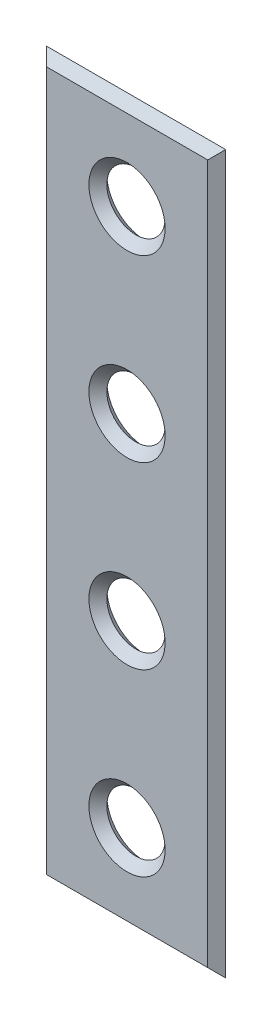
ISO-10303-21;
HEADER;
FILE_DESCRIPTION(('STEP AP214'),'2;1');
FILE_NAME('part.step','',(''),(''),'','','');
FILE_SCHEMA(('AUTOMOTIVE_DESIGN { 1 0 10303 214 1 1 1 1 }'));
ENDSEC;
DATA;
#1=APPLICATION_CONTEXT('core data for automotive mechanical design processes');
#2=APPLICATION_PROTOCOL_DEFINITION('international standard','automotive_design',2000,#1);
#3=PRODUCT_CONTEXT('',#1,'mechanical');
#4=PRODUCT('Part','Part','',(#3));
#5=PRODUCT_RELATED_PRODUCT_CATEGORY('part','',(#4));
#6=PRODUCT_DEFINITION_FORMATION('','',#4);
#7=PRODUCT_DEFINITION_CONTEXT('part definition',#1,'design');
#8=PRODUCT_DEFINITION('design','',#6,#7);
#9=PRODUCT_DEFINITION_SHAPE('','',#8);
#10=(LENGTH_UNIT() NAMED_UNIT(*) SI_UNIT(.MILLI.,.METRE.));
#11=(NAMED_UNIT(*) PLANE_ANGLE_UNIT() SI_UNIT($,.RADIAN.));
#12=(NAMED_UNIT(*) SI_UNIT($,.STERADIAN.) SOLID_ANGLE_UNIT());
#13=UNCERTAINTY_MEASURE_WITH_UNIT(LENGTH_MEASURE(1.E-05),#10,'distance_accuracy_value','');
#14=(GEOMETRIC_REPRESENTATION_CONTEXT(3) GLOBAL_UNCERTAINTY_ASSIGNED_CONTEXT((#13)) GLOBAL_UNIT_ASSIGNED_CONTEXT((#10,
#11,#12)) REPRESENTATION_CONTEXT('',''));
#15=CARTESIAN_POINT('',(0.,0.,0.));
#16=DIRECTION('',(0.,0.,1.));
#17=DIRECTION('',(1.,0.,0.));
#18=AXIS2_PLACEMENT_3D('',#15,#16,#17);
#19=CARTESIAN_POINT('',(0.,0.,8.));
#20=DIRECTION('',(0.,0.,-1.));
#21=DIRECTION('',(-1.,0.,0.));
#22=AXIS2_PLACEMENT_3D('',#19,#20,#21);
#23=PLANE('',#22);
#24=CARTESIAN_POINT('',(40.,40.,8.));
#25=DIRECTION('',(0.,0.,-1.));
#26=DIRECTION('',(-1.,0.,0.));
#27=AXIS2_PLACEMENT_3D('',#24,#25,#26);
#28=CIRCLE('',#27,17.);
#29=CARTESIAN_POINT('',(23.,40.,8.));
#30=VERTEX_POINT('',#29);
#31=EDGE_CURVE('E11',#30,#30,#28,.T.);
#32=ORIENTED_EDGE('',*,*,#31,.T.);
#33=EDGE_LOOP('',(#32));
#34=FACE_BOUND('',#33,.T.);
#35=CARTESIAN_POINT('',(40.,200.,8.));
#36=DIRECTION('',(0.,0.,-1.));
#37=DIRECTION('',(-1.,0.,0.));
#38=AXIS2_PLACEMENT_3D('',#35,#36,#37);
#39=CIRCLE('',#38,17.);
#40=CARTESIAN_POINT('',(22.9999999999999,200.,8.));
#41=VERTEX_POINT('',#40);
#42=EDGE_CURVE('E44',#41,#41,#39,.T.);
#43=ORIENTED_EDGE('',*,*,#42,.T.);
#44=EDGE_LOOP('',(#43));
#45=FACE_BOUND('',#44,.T.);
#46=DIRECTION('',(0.,1.,0.));
#47=VECTOR('',#46,1.);
#48=CARTESIAN_POINT('',(76.,0.,8.));
#49=LINE('',#48,#47);
#50=CARTESIAN_POINT('',(76.,4.00000000000001,8.));
#51=VERTEX_POINT('',#50);
#52=CARTESIAN_POINT('',(76.,316.,8.));
#53=VERTEX_POINT('',#52);
#54=EDGE_CURVE('E53',#51,#53,#49,.T.);
#55=ORIENTED_EDGE('',*,*,#54,.T.);
#56=DIRECTION('',(-1.,0.,0.));
#57=VECTOR('',#56,1.);
#58=CARTESIAN_POINT('',(0.,316.,8.));
#59=LINE('',#58,#57);
#60=CARTESIAN_POINT('',(3.99999999999993,316.,8.));
#61=VERTEX_POINT('',#60);
#62=EDGE_CURVE('E102',#53,#61,#59,.T.);
#63=ORIENTED_EDGE('',*,*,#62,.T.);
#64=DIRECTION('',(0.,-1.,0.));
#65=VECTOR('',#64,1.);
#66=CARTESIAN_POINT('',(4.,0.,8.));
#67=LINE('',#66,#65);
#68=CARTESIAN_POINT('',(4.,4.,8.));
#69=VERTEX_POINT('',#68);
#70=EDGE_CURVE('E97',#61,#69,#67,.T.);
#71=ORIENTED_EDGE('',*,*,#70,.T.);
#72=DIRECTION('',(1.,0.,0.));
#73=VECTOR('',#72,1.);
#74=CARTESIAN_POINT('',(0.,4.,8.));
#75=LINE('',#74,#73);
#76=EDGE_CURVE('E101',#69,#51,#75,.T.);
#77=ORIENTED_EDGE('',*,*,#76,.T.);
#78=EDGE_LOOP('',(#55,#63,#71,#77));
#79=FACE_BOUND('',#78,.T.);
#80=CARTESIAN_POINT('',(40.,280.,8.));
#81=DIRECTION('',(0.,0.,-1.));
#82=DIRECTION('',(-1.,0.,0.));
#83=AXIS2_PLACEMENT_3D('',#80,#81,#82);
#84=CIRCLE('',#83,17.);
#85=CARTESIAN_POINT('',(22.9999999999999,280.,8.));
#86=VERTEX_POINT('',#85);
#87=EDGE_CURVE('E103',#86,#86,#84,.T.);
#88=ORIENTED_EDGE('',*,*,#87,.T.);
#89=EDGE_LOOP('',(#88));
#90=FACE_BOUND('',#89,.T.);
#91=CARTESIAN_POINT('',(40.,120.,8.));
#92=DIRECTION('',(0.,0.,-1.));
#93=DIRECTION('',(-1.,0.,0.));
#94=AXIS2_PLACEMENT_3D('',#91,#92,#93);
#95=CIRCLE('',#94,17.);
#96=CARTESIAN_POINT('',(23.,120.,8.));
#97=VERTEX_POINT('',#96);
#98=EDGE_CURVE('E230',#97,#97,#95,.T.);
#99=ORIENTED_EDGE('',*,*,#98,.T.);
#100=EDGE_LOOP('',(#99));
#101=FACE_BOUND('',#100,.T.);
#102=ADVANCED_FACE('F34',(#34,#45,#79,#90,#101),#23,.F.);
#103=CARTESIAN_POINT('',(0.,0.,0.));
#104=DIRECTION('',(0.,0.,-1.));
#105=DIRECTION('',(-1.,0.,0.));
#106=AXIS2_PLACEMENT_3D('',#103,#104,#105);
#107=PLANE('',#106);
#108=CARTESIAN_POINT('',(40.,40.,0.));
#109=DIRECTION('',(0.,0.,-1.));
#110=DIRECTION('',(-1.,0.,0.));
#111=AXIS2_PLACEMENT_3D('',#108,#109,#110);
#112=CIRCLE('',#111,17.);
#113=CARTESIAN_POINT('',(23.,40.,0.));
#114=VERTEX_POINT('',#113);
#115=EDGE_CURVE('E232',#114,#114,#112,.F.);
#116=ORIENTED_EDGE('',*,*,#115,.T.);
#117=EDGE_LOOP('',(#116));
#118=FACE_BOUND('',#117,.T.);
#119=CARTESIAN_POINT('',(40.,200.,0.));
#120=DIRECTION('',(0.,0.,-1.));
#121=DIRECTION('',(-1.,0.,0.));
#122=AXIS2_PLACEMENT_3D('',#119,#120,#121);
#123=CIRCLE('',#122,17.);
#124=CARTESIAN_POINT('',(23.,200.,0.));
#125=VERTEX_POINT('',#124);
#126=EDGE_CURVE('E237',#125,#125,#123,.F.);
#127=ORIENTED_EDGE('',*,*,#126,.T.);
#128=EDGE_LOOP('',(#127));
#129=FACE_BOUND('',#128,.T.);
#130=DIRECTION('',(0.,-1.,0.));
#131=VECTOR('',#130,1.);
#132=CARTESIAN_POINT('',(76.,0.,0.));
#133=LINE('',#132,#131);
#134=CARTESIAN_POINT('',(76.,316.,0.));
#135=VERTEX_POINT('',#134);
#136=CARTESIAN_POINT('',(76.,4.00000000000002,0.));
#137=VERTEX_POINT('',#136);
#138=EDGE_CURVE('E243',#135,#137,#133,.T.);
#139=ORIENTED_EDGE('',*,*,#138,.T.);
#140=DIRECTION('',(-1.,0.,0.));
#141=VECTOR('',#140,1.);
#142=CARTESIAN_POINT('',(0.,4.00000000000001,0.));
#143=LINE('',#142,#141);
#144=CARTESIAN_POINT('',(4.00000000000001,4.00000000000002,0.));
#145=VERTEX_POINT('',#144);
#146=EDGE_CURVE('E240',#137,#145,#143,.T.);
#147=ORIENTED_EDGE('',*,*,#146,.T.);
#148=DIRECTION('',(0.,1.,0.));
#149=VECTOR('',#148,1.);
#150=CARTESIAN_POINT('',(3.99999999999994,320.,0.));
#151=LINE('',#150,#149);
#152=CARTESIAN_POINT('',(3.99999999999995,316.,0.));
#153=VERTEX_POINT('',#152);
#154=EDGE_CURVE('E247',#145,#153,#151,.T.);
#155=ORIENTED_EDGE('',*,*,#154,.T.);
#156=DIRECTION('',(1.,0.,0.));
#157=VECTOR('',#156,1.);
#158=CARTESIAN_POINT('',(80.,316.,0.));
#159=LINE('',#158,#157);
#160=EDGE_CURVE('E245',#153,#135,#159,.T.);
#161=ORIENTED_EDGE('',*,*,#160,.T.);
#162=EDGE_LOOP('',(#139,#147,#155,#161));
#163=FACE_BOUND('',#162,.T.);
#164=CARTESIAN_POINT('',(40.,280.,0.));
#165=DIRECTION('',(0.,0.,-1.));
#166=DIRECTION('',(-1.,0.,0.));
#167=AXIS2_PLACEMENT_3D('',#164,#165,#166);
#168=CIRCLE('',#167,17.);
#169=CARTESIAN_POINT('',(23.,280.,0.));
#170=VERTEX_POINT('',#169);
#171=EDGE_CURVE('E249',#170,#170,#168,.F.);
#172=ORIENTED_EDGE('',*,*,#171,.T.);
#173=EDGE_LOOP('',(#172));
#174=FACE_BOUND('',#173,.T.);
#175=CARTESIAN_POINT('',(40.,120.,0.));
#176=DIRECTION('',(0.,0.,-1.));
#177=DIRECTION('',(-1.,0.,0.));
#178=AXIS2_PLACEMENT_3D('',#175,#176,#177);
#179=CIRCLE('',#178,17.);
#180=CARTESIAN_POINT('',(23.,120.,0.));
#181=VERTEX_POINT('',#180);
#182=EDGE_CURVE('E126',#181,#181,#179,.F.);
#183=ORIENTED_EDGE('',*,*,#182,.T.);
#184=EDGE_LOOP('',(#183));
#185=FACE_BOUND('',#184,.T.);
#186=ADVANCED_FACE('F171',(#118,#129,#163,#174,#185),#107,.T.);
#187=CARTESIAN_POINT('',(40.,40.,4.));
#188=DIRECTION('',(0.,0.,1.));
#189=DIRECTION('',(1.,0.,0.));
#190=AXIS2_PLACEMENT_3D('',#187,#188,#189);
#191=CONICAL_SURFACE('',#190,13.,0.78539816339745);
#192=ORIENTED_EDGE('',*,*,#31,.F.);
#193=EDGE_LOOP('',(#192));
#194=FACE_BOUND('',#193,.T.);
#195=CARTESIAN_POINT('',(40.,40.,4.));
#196=DIRECTION('',(0.,0.,-1.));
#197=DIRECTION('',(-1.,0.,0.));
#198=AXIS2_PLACEMENT_3D('',#195,#196,#197);
#199=CIRCLE('',#198,13.);
#200=CARTESIAN_POINT('',(27.,40.,4.));
#201=VERTEX_POINT('',#200);
#202=EDGE_CURVE('E123',#201,#201,#199,.F.);
#203=ORIENTED_EDGE('',*,*,#202,.F.);
#204=EDGE_LOOP('',(#203));
#205=FACE_BOUND('',#204,.T.);
#206=ADVANCED_FACE('F177',(#194,#205),#191,.F.);
#207=CARTESIAN_POINT('',(40.,40.,0.));
#208=DIRECTION('',(0.,0.,-1.));
#209=DIRECTION('',(-1.,0.,0.));
#210=AXIS2_PLACEMENT_3D('',#207,#208,#209);
#211=CONICAL_SURFACE('',#210,17.,0.785398163397446);
#212=ORIENTED_EDGE('',*,*,#202,.T.);
#213=EDGE_LOOP('',(#212));
#214=FACE_BOUND('',#213,.T.);
#215=ORIENTED_EDGE('',*,*,#115,.F.);
#216=EDGE_LOOP('',(#215));
#217=FACE_BOUND('',#216,.T.);
#218=ADVANCED_FACE('F182',(#214,#217),#211,.F.);
#219=CARTESIAN_POINT('',(40.,200.,4.));
#220=DIRECTION('',(0.,0.,1.));
#221=DIRECTION('',(1.,0.,0.));
#222=AXIS2_PLACEMENT_3D('',#219,#220,#221);
#223=CONICAL_SURFACE('',#222,13.,0.78539816339745);
#224=ORIENTED_EDGE('',*,*,#42,.F.);
#225=EDGE_LOOP('',(#224));
#226=FACE_BOUND('',#225,.T.);
#227=CARTESIAN_POINT('',(40.,200.,4.));
#228=DIRECTION('',(0.,0.,-1.));
#229=DIRECTION('',(-1.,0.,0.));
#230=AXIS2_PLACEMENT_3D('',#227,#228,#229);
#231=CIRCLE('',#230,13.);
#232=CARTESIAN_POINT('',(27.,200.,4.));
#233=VERTEX_POINT('',#232);
#234=EDGE_CURVE('E127',#233,#233,#231,.F.);
#235=ORIENTED_EDGE('',*,*,#234,.F.);
#236=EDGE_LOOP('',(#235));
#237=FACE_BOUND('',#236,.T.);
#238=ADVANCED_FACE('F185',(#226,#237),#223,.F.);
#239=CARTESIAN_POINT('',(40.,200.,0.));
#240=DIRECTION('',(0.,0.,-1.));
#241=DIRECTION('',(-1.,0.,0.));
#242=AXIS2_PLACEMENT_3D('',#239,#240,#241);
#243=CONICAL_SURFACE('',#242,17.,0.785398163397447);
#244=ORIENTED_EDGE('',*,*,#234,.T.);
#245=EDGE_LOOP('',(#244));
#246=FACE_BOUND('',#245,.T.);
#247=ORIENTED_EDGE('',*,*,#126,.F.);
#248=EDGE_LOOP('',(#247));
#249=FACE_BOUND('',#248,.T.);
#250=ADVANCED_FACE('F190',(#246,#249),#243,.F.);
#251=CARTESIAN_POINT('',(0.,316.,8.));
#252=DIRECTION('',(0.,-0.707106781186549,-0.707106781186547));
#253=DIRECTION('',(0.,0.707106781186547,-0.707106781186549));
#254=AXIS2_PLACEMENT_3D('',#251,#252,#253);
#255=PLANE('',#254);
#256=DIRECTION('',(-0.577350269189625,0.577350269189625,-0.577350269189627));
#257=VECTOR('',#256,1.);
#258=CARTESIAN_POINT('',(109.333333333333,210.666666666667,113.333333333333));
#259=LINE('',#258,#257);
#260=CARTESIAN_POINT('',(0.,320.,4.));
#261=VERTEX_POINT('',#260);
#262=EDGE_CURVE('E76',#61,#261,#259,.T.);
#263=ORIENTED_EDGE('',*,*,#262,.F.);
#264=ORIENTED_EDGE('',*,*,#62,.F.);
#265=DIRECTION('',(-0.577350269189625,-0.577350269189625,0.577350269189627));
#266=VECTOR('',#265,1.);
#267=CARTESIAN_POINT('',(-29.3333333333331,210.666666666667,113.333333333333));
#268=LINE('',#267,#266);
#269=CARTESIAN_POINT('',(80.,320.,4.));
#270=VERTEX_POINT('',#269);
#271=EDGE_CURVE('E69',#270,#53,#268,.T.);
#272=ORIENTED_EDGE('',*,*,#271,.F.);
#273=DIRECTION('',(1.,0.,0.));
#274=VECTOR('',#273,1.);
#275=CARTESIAN_POINT('',(0.,320.,3.99999999999999));
#276=LINE('',#275,#274);
#277=EDGE_CURVE('E148',#261,#270,#276,.T.);
#278=ORIENTED_EDGE('',*,*,#277,.F.);
#279=EDGE_LOOP('',(#263,#264,#272,#278));
#280=FACE_BOUND('',#279,.T.);
#281=ADVANCED_FACE('F193',(#280),#255,.F.);
#282=CARTESIAN_POINT('',(4.,0.,8.));
#283=DIRECTION('',(0.707106781186549,0.,-0.707106781186546));
#284=DIRECTION('',(-0.707106781186546,0.,-0.707106781186549));
#285=AXIS2_PLACEMENT_3D('',#282,#283,#284);
#286=PLANE('',#285);
#287=ORIENTED_EDGE('',*,*,#70,.F.);
#288=ORIENTED_EDGE('',*,*,#262,.T.);
#289=DIRECTION('',(0.,1.,0.));
#290=VECTOR('',#289,1.);
#291=CARTESIAN_POINT('',(0.,0.,3.99999999999999));
#292=LINE('',#291,#290);
#293=CARTESIAN_POINT('',(0.,0.,4.));
#294=VERTEX_POINT('',#293);
#295=EDGE_CURVE('E109',#294,#261,#292,.T.);
#296=ORIENTED_EDGE('',*,*,#295,.F.);
#297=DIRECTION('',(0.577350269189625,0.577350269189625,0.577350269189627));
#298=VECTOR('',#297,1.);
#299=CARTESIAN_POINT('',(2.66666666666667,2.66666666666667,6.66666666666666));
#300=LINE('',#299,#298);
#301=EDGE_CURVE('E106',#69,#294,#300,.F.);
#302=ORIENTED_EDGE('',*,*,#301,.F.);
#303=EDGE_LOOP('',(#287,#288,#296,#302));
#304=FACE_BOUND('',#303,.T.);
#305=ADVANCED_FACE('F107',(#304),#286,.F.);
#306=CARTESIAN_POINT('',(76.,0.,8.));
#307=DIRECTION('',(-0.707106781186549,0.,-0.707106781186547));
#308=DIRECTION('',(-0.707106781186547,0.,0.707106781186549));
#309=AXIS2_PLACEMENT_3D('',#306,#307,#308);
#310=PLANE('',#309);
#311=ORIENTED_EDGE('',*,*,#271,.T.);
#312=ORIENTED_EDGE('',*,*,#54,.F.);
#313=DIRECTION('',(-0.577350269189625,0.577350269189625,0.577350269189627));
#314=VECTOR('',#313,1.);
#315=CARTESIAN_POINT('',(50.6666666666667,29.3333333333333,33.3333333333334));
#316=LINE('',#315,#314);
#317=CARTESIAN_POINT('',(80.,0.,4.));
#318=VERTEX_POINT('',#317);
#319=EDGE_CURVE('E112',#318,#51,#316,.T.);
#320=ORIENTED_EDGE('',*,*,#319,.F.);
#321=DIRECTION('',(0.,-1.,0.));
#322=VECTOR('',#321,1.);
#323=CARTESIAN_POINT('',(80.,0.,3.99999999999999));
#324=LINE('',#323,#322);
#325=EDGE_CURVE('E140',#270,#318,#324,.T.);
#326=ORIENTED_EDGE('',*,*,#325,.F.);
#327=EDGE_LOOP('',(#311,#312,#320,#326));
#328=FACE_BOUND('',#327,.T.);
#329=ADVANCED_FACE('F214',(#328),#310,.F.);
#330=CARTESIAN_POINT('',(0.,320.,4.));
#331=DIRECTION('',(0.,0.707106781186547,-0.707106781186548));
#332=DIRECTION('',(0.,0.707106781186548,0.707106781186547));
#333=AXIS2_PLACEMENT_3D('',#330,#331,#332);
#334=PLANE('',#333);
#335=DIRECTION('',(-0.577350269189627,-0.577350269189625,-0.577350269189625));
#336=VECTOR('',#335,1.);
#337=CARTESIAN_POINT('',(53.3333333333332,293.333333333333,-22.6666666666667));
#338=LINE('',#337,#336);
#339=EDGE_CURVE('E137',#135,#270,#338,.F.);
#340=ORIENTED_EDGE('',*,*,#339,.F.);
#341=ORIENTED_EDGE('',*,*,#160,.F.);
#342=DIRECTION('',(0.577350269189627,-0.577350269189625,-0.577350269189625));
#343=VECTOR('',#342,1.);
#344=CARTESIAN_POINT('',(106.666666666667,213.333333333333,-102.666666666666));
#345=LINE('',#344,#343);
#346=EDGE_CURVE('E145',#261,#153,#345,.T.);
#347=ORIENTED_EDGE('',*,*,#346,.F.);
#348=ORIENTED_EDGE('',*,*,#277,.T.);
#349=EDGE_LOOP('',(#340,#341,#347,#348));
#350=FACE_BOUND('',#349,.T.);
#351=ADVANCED_FACE('F210',(#350),#334,.T.);
#352=CARTESIAN_POINT('',(0.,0.,4.));
#353=DIRECTION('',(-0.707106781186546,0.,-0.707106781186549));
#354=DIRECTION('',(-0.707106781186549,0.,0.707106781186546));
#355=AXIS2_PLACEMENT_3D('',#352,#353,#354);
#356=PLANE('',#355);
#357=ORIENTED_EDGE('',*,*,#346,.T.);
#358=ORIENTED_EDGE('',*,*,#154,.F.);
#359=DIRECTION('',(-0.577350269189626,-0.577350269189627,0.577350269189624));
#360=VECTOR('',#359,1.);
#361=CARTESIAN_POINT('',(0.,0.,4.));
#362=LINE('',#361,#360);
#363=EDGE_CURVE('E84',#294,#145,#362,.F.);
#364=ORIENTED_EDGE('',*,*,#363,.F.);
#365=ORIENTED_EDGE('',*,*,#295,.T.);
#366=EDGE_LOOP('',(#357,#358,#364,#365));
#367=FACE_BOUND('',#366,.T.);
#368=ADVANCED_FACE('F207',(#367),#356,.T.);
#369=CARTESIAN_POINT('',(0.,4.,8.));
#370=DIRECTION('',(0.,0.707106781186549,-0.707106781186546));
#371=DIRECTION('',(0.,0.707106781186546,0.707106781186549));
#372=AXIS2_PLACEMENT_3D('',#369,#370,#371);
#373=PLANE('',#372);
#374=ORIENTED_EDGE('',*,*,#76,.F.);
#375=ORIENTED_EDGE('',*,*,#301,.T.);
#376=DIRECTION('',(-1.,0.,0.));
#377=VECTOR('',#376,1.);
#378=CARTESIAN_POINT('',(0.,0.,3.99999999999999));
#379=LINE('',#378,#377);
#380=EDGE_CURVE('E133',#318,#294,#379,.T.);
#381=ORIENTED_EDGE('',*,*,#380,.F.);
#382=ORIENTED_EDGE('',*,*,#319,.T.);
#383=EDGE_LOOP('',(#374,#375,#381,#382));
#384=FACE_BOUND('',#383,.T.);
#385=ADVANCED_FACE('F115',(#384),#373,.F.);
#386=CARTESIAN_POINT('',(80.,0.,4.));
#387=DIRECTION('',(0.707106781186546,0.,-0.707106781186549));
#388=DIRECTION('',(-0.707106781186549,0.,-0.707106781186546));
#389=AXIS2_PLACEMENT_3D('',#386,#387,#388);
#390=PLANE('',#389);
#391=ORIENTED_EDGE('',*,*,#339,.T.);
#392=ORIENTED_EDGE('',*,*,#325,.T.);
#393=DIRECTION('',(-0.577350269189627,0.577350269189626,-0.577350269189624));
#394=VECTOR('',#393,1.);
#395=CARTESIAN_POINT('',(80.,0.,4.));
#396=LINE('',#395,#394);
#397=EDGE_CURVE('E130',#137,#318,#396,.F.);
#398=ORIENTED_EDGE('',*,*,#397,.F.);
#399=ORIENTED_EDGE('',*,*,#138,.F.);
#400=EDGE_LOOP('',(#391,#392,#398,#399));
#401=FACE_BOUND('',#400,.T.);
#402=ADVANCED_FACE('F201',(#401),#390,.T.);
#403=CARTESIAN_POINT('',(0.,0.,4.));
#404=DIRECTION('',(0.,-0.707106781186546,-0.707106781186549));
#405=DIRECTION('',(0.,0.707106781186549,-0.707106781186546));
#406=AXIS2_PLACEMENT_3D('',#403,#404,#405);
#407=PLANE('',#406);
#408=ORIENTED_EDGE('',*,*,#363,.T.);
#409=ORIENTED_EDGE('',*,*,#146,.F.);
#410=ORIENTED_EDGE('',*,*,#397,.T.);
#411=ORIENTED_EDGE('',*,*,#380,.T.);
#412=EDGE_LOOP('',(#408,#409,#410,#411));
#413=FACE_BOUND('',#412,.T.);
#414=ADVANCED_FACE('F198',(#413),#407,.T.);
#415=CARTESIAN_POINT('',(40.,280.,4.));
#416=DIRECTION('',(0.,0.,1.));
#417=DIRECTION('',(1.,0.,0.));
#418=AXIS2_PLACEMENT_3D('',#415,#416,#417);
#419=CONICAL_SURFACE('',#418,13.,0.78539816339745);
#420=ORIENTED_EDGE('',*,*,#87,.F.);
#421=EDGE_LOOP('',(#420));
#422=FACE_BOUND('',#421,.T.);
#423=CARTESIAN_POINT('',(40.,280.,4.));
#424=DIRECTION('',(0.,0.,-1.));
#425=DIRECTION('',(-1.,0.,0.));
#426=AXIS2_PLACEMENT_3D('',#423,#424,#425);
#427=CIRCLE('',#426,13.);
#428=CARTESIAN_POINT('',(27.,280.,4.));
#429=VERTEX_POINT('',#428);
#430=EDGE_CURVE('E134',#429,#429,#427,.F.);
#431=ORIENTED_EDGE('',*,*,#430,.F.);
#432=EDGE_LOOP('',(#431));
#433=FACE_BOUND('',#432,.T.);
#434=ADVANCED_FACE('F167',(#422,#433),#419,.F.);
#435=CARTESIAN_POINT('',(40.,280.,0.));
#436=DIRECTION('',(0.,0.,-1.));
#437=DIRECTION('',(-1.,0.,0.));
#438=AXIS2_PLACEMENT_3D('',#435,#436,#437);
#439=CONICAL_SURFACE('',#438,17.,0.785398163397447);
#440=ORIENTED_EDGE('',*,*,#430,.T.);
#441=EDGE_LOOP('',(#440));
#442=FACE_BOUND('',#441,.T.);
#443=ORIENTED_EDGE('',*,*,#171,.F.);
#444=EDGE_LOOP('',(#443));
#445=FACE_BOUND('',#444,.T.);
#446=ADVANCED_FACE('F161',(#442,#445),#439,.F.);
#447=CARTESIAN_POINT('',(40.,120.,4.));
#448=DIRECTION('',(0.,0.,1.));
#449=DIRECTION('',(1.,0.,0.));
#450=AXIS2_PLACEMENT_3D('',#447,#448,#449);
#451=CONICAL_SURFACE('',#450,13.,0.78539816339745);
#452=ORIENTED_EDGE('',*,*,#98,.F.);
#453=EDGE_LOOP('',(#452));
#454=FACE_BOUND('',#453,.T.);
#455=CARTESIAN_POINT('',(40.,120.,4.));
#456=DIRECTION('',(0.,0.,-1.));
#457=DIRECTION('',(-1.,0.,0.));
#458=AXIS2_PLACEMENT_3D('',#455,#456,#457);
#459=CIRCLE('',#458,13.);
#460=CARTESIAN_POINT('',(27.,120.,4.));
#461=VERTEX_POINT('',#460);
#462=EDGE_CURVE('E38',#461,#461,#459,.F.);
#463=ORIENTED_EDGE('',*,*,#462,.F.);
#464=EDGE_LOOP('',(#463));
#465=FACE_BOUND('',#464,.T.);
#466=ADVANCED_FACE('F36',(#454,#465),#451,.F.);
#467=CARTESIAN_POINT('',(40.,120.,0.));
#468=DIRECTION('',(0.,0.,-1.));
#469=DIRECTION('',(-1.,0.,0.));
#470=AXIS2_PLACEMENT_3D('',#467,#468,#469);
#471=CONICAL_SURFACE('',#470,17.,0.785398163397446);
#472=ORIENTED_EDGE('',*,*,#462,.T.);
#473=EDGE_LOOP('',(#472));
#474=FACE_BOUND('',#473,.T.);
#475=ORIENTED_EDGE('',*,*,#182,.F.);
#476=EDGE_LOOP('',(#475));
#477=FACE_BOUND('',#476,.T.);
#478=ADVANCED_FACE('F157',(#474,#477),#471,.F.);
#479=CLOSED_SHELL('',(#102,#186,#206,#218,#238,#250,#281,#305,#329,#351,#368,#385,#402,#414,
#434,#446,#466,#478));
#480=MANIFOLD_SOLID_BREP('B2',#479);
#481=ADVANCED_BREP_SHAPE_REPRESENTATION('',(#18,#480),#14);
#482=SHAPE_DEFINITION_REPRESENTATION(#9,#481);
ENDSEC;
END-ISO-10303-21;
